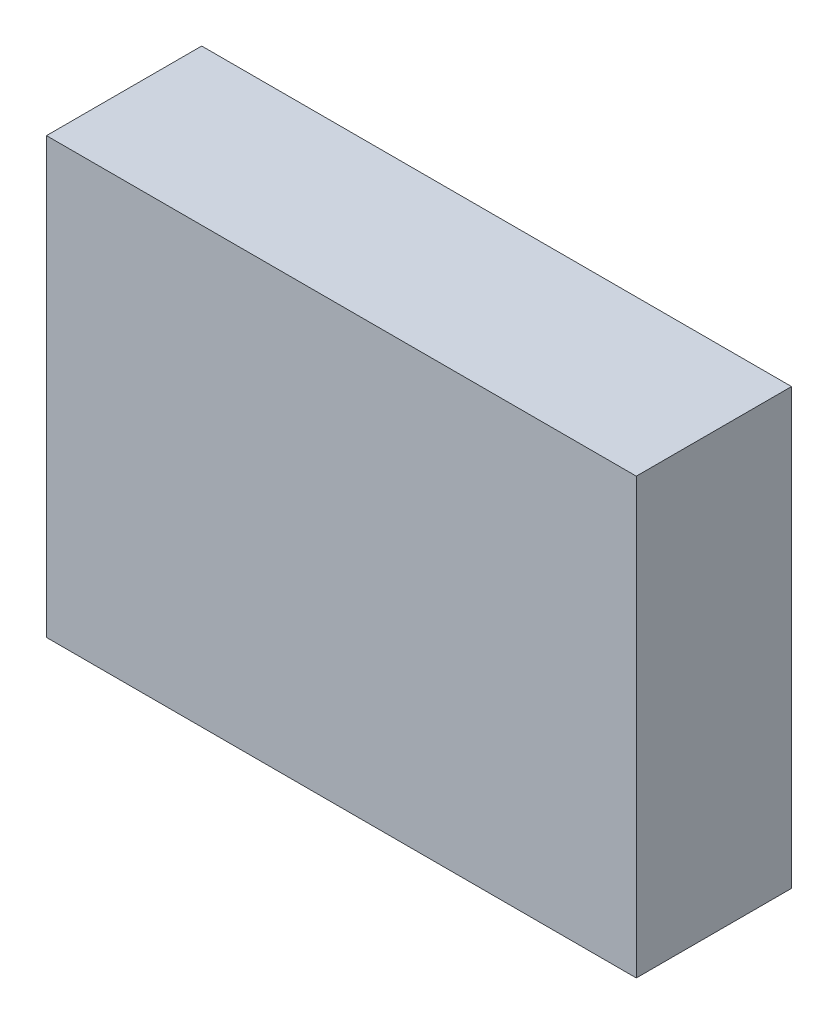
ISO-10303-21;
HEADER;
FILE_DESCRIPTION(('STEP AP214'),'2;1');
FILE_NAME('part.step','',(''),(''),'','','');
FILE_SCHEMA(('AUTOMOTIVE_DESIGN { 1 0 10303 214 1 1 1 1 }'));
ENDSEC;
DATA;
#1=APPLICATION_CONTEXT('core data for automotive mechanical design processes');
#2=APPLICATION_PROTOCOL_DEFINITION('international standard','automotive_design',2000,#1);
#3=PRODUCT_CONTEXT('',#1,'mechanical');
#4=PRODUCT('Part','Part','',(#3));
#5=PRODUCT_RELATED_PRODUCT_CATEGORY('part','',(#4));
#6=PRODUCT_DEFINITION_FORMATION('','',#4);
#7=PRODUCT_DEFINITION_CONTEXT('part definition',#1,'design');
#8=PRODUCT_DEFINITION('design','',#6,#7);
#9=PRODUCT_DEFINITION_SHAPE('','',#8);
#10=(LENGTH_UNIT() NAMED_UNIT(*) SI_UNIT(.MILLI.,.METRE.));
#11=(NAMED_UNIT(*) PLANE_ANGLE_UNIT() SI_UNIT($,.RADIAN.));
#12=(NAMED_UNIT(*) SI_UNIT($,.STERADIAN.) SOLID_ANGLE_UNIT());
#13=UNCERTAINTY_MEASURE_WITH_UNIT(LENGTH_MEASURE(1.E-05),#10,'distance_accuracy_value','');
#14=(GEOMETRIC_REPRESENTATION_CONTEXT(3) GLOBAL_UNCERTAINTY_ASSIGNED_CONTEXT((#13)) GLOBAL_UNIT_ASSIGNED_CONTEXT((#10,
#11,#12)) REPRESENTATION_CONTEXT('',''));
#15=CARTESIAN_POINT('',(0.,0.,0.));
#16=DIRECTION('',(0.,0.,1.));
#17=DIRECTION('',(1.,0.,0.));
#18=AXIS2_PLACEMENT_3D('',#15,#16,#17);
#19=CARTESIAN_POINT('',(95.,-70.,50.));
#20=DIRECTION('',(-1.,0.,0.));
#21=DIRECTION('',(0.,0.,1.));
#22=AXIS2_PLACEMENT_3D('',#19,#20,#21);
#23=PLANE('',#22);
#24=DIRECTION('',(0.,1.,0.));
#25=VECTOR('',#24,1.);
#26=CARTESIAN_POINT('',(95.,-70.,0.));
#27=LINE('',#26,#25);
#28=CARTESIAN_POINT('',(95.,-70.,0.));
#29=VERTEX_POINT('',#28);
#30=CARTESIAN_POINT('',(95.,70.,0.));
#31=VERTEX_POINT('',#30);
#32=EDGE_CURVE('E96',#29,#31,#27,.T.);
#33=ORIENTED_EDGE('',*,*,#32,.T.);
#34=DIRECTION('',(0.,0.,-1.));
#35=VECTOR('',#34,1.);
#36=CARTESIAN_POINT('',(95.,70.,50.));
#37=LINE('',#36,#35);
#38=CARTESIAN_POINT('',(95.,70.,50.));
#39=VERTEX_POINT('',#38);
#40=EDGE_CURVE('E11',#39,#31,#37,.T.);
#41=ORIENTED_EDGE('',*,*,#40,.F.);
#42=DIRECTION('',(0.,1.,0.));
#43=VECTOR('',#42,1.);
#44=CARTESIAN_POINT('',(95.,-70.,50.));
#45=LINE('',#44,#43);
#46=CARTESIAN_POINT('',(95.,-70.,50.));
#47=VERTEX_POINT('',#46);
#48=EDGE_CURVE('E84',#47,#39,#45,.T.);
#49=ORIENTED_EDGE('',*,*,#48,.F.);
#50=DIRECTION('',(0.,0.,-1.));
#51=VECTOR('',#50,1.);
#52=CARTESIAN_POINT('',(95.,-70.,50.));
#53=LINE('',#52,#51);
#54=EDGE_CURVE('E92',#47,#29,#53,.T.);
#55=ORIENTED_EDGE('',*,*,#54,.T.);
#56=EDGE_LOOP('',(#33,#41,#49,#55));
#57=FACE_BOUND('',#56,.T.);
#58=ADVANCED_FACE('F33',(#57),#23,.F.);
#59=CARTESIAN_POINT('',(-95.,70.,50.));
#60=DIRECTION('',(0.,-1.,0.));
#61=DIRECTION('',(0.,0.,-1.));
#62=AXIS2_PLACEMENT_3D('',#59,#60,#61);
#63=PLANE('',#62);
#64=DIRECTION('',(-1.,0.,0.));
#65=VECTOR('',#64,1.);
#66=CARTESIAN_POINT('',(-95.,70.,0.));
#67=LINE('',#66,#65);
#68=CARTESIAN_POINT('',(-95.,70.,0.));
#69=VERTEX_POINT('',#68);
#70=EDGE_CURVE('E88',#31,#69,#67,.T.);
#71=ORIENTED_EDGE('',*,*,#70,.T.);
#72=DIRECTION('',(0.,0.,-1.));
#73=VECTOR('',#72,1.);
#74=CARTESIAN_POINT('',(-95.,70.,50.));
#75=LINE('',#74,#73);
#76=CARTESIAN_POINT('',(-95.,70.,50.));
#77=VERTEX_POINT('',#76);
#78=EDGE_CURVE('E41',#77,#69,#75,.T.);
#79=ORIENTED_EDGE('',*,*,#78,.F.);
#80=DIRECTION('',(-1.,0.,0.));
#81=VECTOR('',#80,1.);
#82=CARTESIAN_POINT('',(-95.,70.,50.));
#83=LINE('',#82,#81);
#84=EDGE_CURVE('E79',#39,#77,#83,.T.);
#85=ORIENTED_EDGE('',*,*,#84,.F.);
#86=ORIENTED_EDGE('',*,*,#40,.T.);
#87=EDGE_LOOP('',(#71,#79,#85,#86));
#88=FACE_BOUND('',#87,.T.);
#89=ADVANCED_FACE('F87',(#88),#63,.F.);
#90=CARTESIAN_POINT('',(-95.,-70.,50.));
#91=DIRECTION('',(1.,0.,0.));
#92=DIRECTION('',(0.,0.,-1.));
#93=AXIS2_PLACEMENT_3D('',#90,#91,#92);
#94=PLANE('',#93);
#95=DIRECTION('',(0.,-1.,0.));
#96=VECTOR('',#95,1.);
#97=CARTESIAN_POINT('',(-95.,-70.,0.));
#98=LINE('',#97,#96);
#99=CARTESIAN_POINT('',(-95.,-70.,0.));
#100=VERTEX_POINT('',#99);
#101=EDGE_CURVE('E66',#69,#100,#98,.T.);
#102=ORIENTED_EDGE('',*,*,#101,.T.);
#103=DIRECTION('',(0.,0.,-1.));
#104=VECTOR('',#103,1.);
#105=CARTESIAN_POINT('',(-95.,-70.,50.));
#106=LINE('',#105,#104);
#107=CARTESIAN_POINT('',(-95.,-70.,50.));
#108=VERTEX_POINT('',#107);
#109=EDGE_CURVE('E89',#108,#100,#106,.T.);
#110=ORIENTED_EDGE('',*,*,#109,.F.);
#111=DIRECTION('',(0.,-1.,0.));
#112=VECTOR('',#111,1.);
#113=CARTESIAN_POINT('',(-95.,-70.,50.));
#114=LINE('',#113,#112);
#115=EDGE_CURVE('E82',#77,#108,#114,.T.);
#116=ORIENTED_EDGE('',*,*,#115,.F.);
#117=ORIENTED_EDGE('',*,*,#78,.T.);
#118=EDGE_LOOP('',(#102,#110,#116,#117));
#119=FACE_BOUND('',#118,.T.);
#120=ADVANCED_FACE('F90',(#119),#94,.F.);
#121=CARTESIAN_POINT('',(-95.,-70.,50.));
#122=DIRECTION('',(0.,1.,0.));
#123=DIRECTION('',(0.,0.,1.));
#124=AXIS2_PLACEMENT_3D('',#121,#122,#123);
#125=PLANE('',#124);
#126=DIRECTION('',(1.,0.,0.));
#127=VECTOR('',#126,1.);
#128=CARTESIAN_POINT('',(-95.,-70.,0.));
#129=LINE('',#128,#127);
#130=EDGE_CURVE('E72',#100,#29,#129,.T.);
#131=ORIENTED_EDGE('',*,*,#130,.T.);
#132=ORIENTED_EDGE('',*,*,#54,.F.);
#133=DIRECTION('',(1.,0.,0.));
#134=VECTOR('',#133,1.);
#135=CARTESIAN_POINT('',(-95.,-70.,50.));
#136=LINE('',#135,#134);
#137=EDGE_CURVE('E49',#108,#47,#136,.T.);
#138=ORIENTED_EDGE('',*,*,#137,.F.);
#139=ORIENTED_EDGE('',*,*,#109,.T.);
#140=EDGE_LOOP('',(#131,#132,#138,#139));
#141=FACE_BOUND('',#140,.T.);
#142=ADVANCED_FACE('F103',(#141),#125,.F.);
#143=CARTESIAN_POINT('',(0.,0.,50.));
#144=DIRECTION('',(0.,0.,-1.));
#145=DIRECTION('',(-1.,0.,0.));
#146=AXIS2_PLACEMENT_3D('',#143,#144,#145);
#147=PLANE('',#146);
#148=ORIENTED_EDGE('',*,*,#48,.T.);
#149=ORIENTED_EDGE('',*,*,#84,.T.);
#150=ORIENTED_EDGE('',*,*,#115,.T.);
#151=ORIENTED_EDGE('',*,*,#137,.T.);
#152=EDGE_LOOP('',(#148,#149,#150,#151));
#153=FACE_BOUND('',#152,.T.);
#154=ADVANCED_FACE('F80',(#153),#147,.F.);
#155=CARTESIAN_POINT('',(0.,0.,0.));
#156=DIRECTION('',(0.,0.,-1.));
#157=DIRECTION('',(-1.,0.,0.));
#158=AXIS2_PLACEMENT_3D('',#155,#156,#157);
#159=PLANE('',#158);
#160=ORIENTED_EDGE('',*,*,#32,.F.);
#161=ORIENTED_EDGE('',*,*,#130,.F.);
#162=ORIENTED_EDGE('',*,*,#101,.F.);
#163=ORIENTED_EDGE('',*,*,#70,.F.);
#164=EDGE_LOOP('',(#160,#161,#162,#163));
#165=FACE_BOUND('',#164,.T.);
#166=ADVANCED_FACE('F106',(#165),#159,.T.);
#167=CLOSED_SHELL('',(#58,#89,#120,#142,#154,#166));
#168=MANIFOLD_SOLID_BREP('B2',#167);
#169=ADVANCED_BREP_SHAPE_REPRESENTATION('',(#18,#168),#14);
#170=SHAPE_DEFINITION_REPRESENTATION(#9,#169);
ENDSEC;
END-ISO-10303-21;
